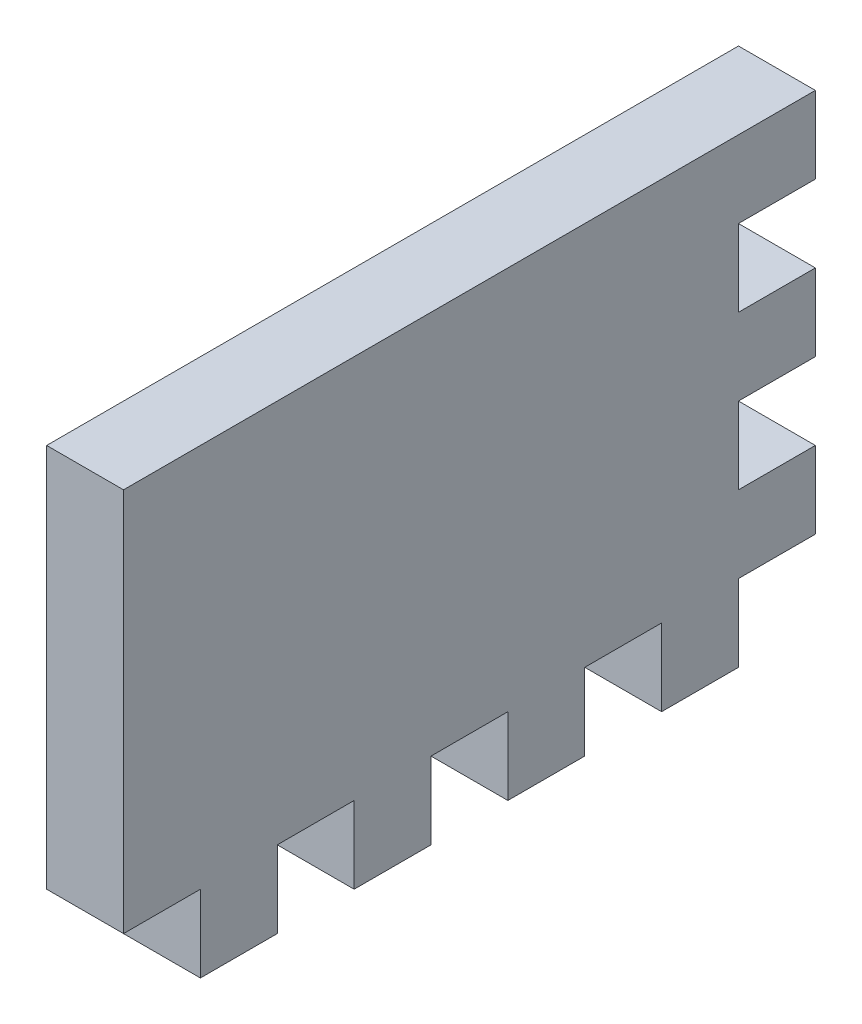
ISO-10303-21;
HEADER;
FILE_DESCRIPTION(('STEP AP214'),'2;1');
FILE_NAME('part.step','',(''),(''),'','','');
FILE_SCHEMA(('AUTOMOTIVE_DESIGN { 1 0 10303 214 1 1 1 1 }'));
ENDSEC;
DATA;
#1=APPLICATION_CONTEXT('core data for automotive mechanical design processes');
#2=APPLICATION_PROTOCOL_DEFINITION('international standard','automotive_design',2000,#1);
#3=PRODUCT_CONTEXT('',#1,'mechanical');
#4=PRODUCT('Part','Part','',(#3));
#5=PRODUCT_RELATED_PRODUCT_CATEGORY('part','',(#4));
#6=PRODUCT_DEFINITION_FORMATION('','',#4);
#7=PRODUCT_DEFINITION_CONTEXT('part definition',#1,'design');
#8=PRODUCT_DEFINITION('design','',#6,#7);
#9=PRODUCT_DEFINITION_SHAPE('','',#8);
#10=(LENGTH_UNIT() NAMED_UNIT(*) SI_UNIT(.MILLI.,.METRE.));
#11=(NAMED_UNIT(*) PLANE_ANGLE_UNIT() SI_UNIT($,.RADIAN.));
#12=(NAMED_UNIT(*) SI_UNIT($,.STERADIAN.) SOLID_ANGLE_UNIT());
#13=UNCERTAINTY_MEASURE_WITH_UNIT(LENGTH_MEASURE(1.E-05),#10,'distance_accuracy_value','');
#14=(GEOMETRIC_REPRESENTATION_CONTEXT(3) GLOBAL_UNCERTAINTY_ASSIGNED_CONTEXT((#13)) GLOBAL_UNIT_ASSIGNED_CONTEXT((#10,
#11,#12)) REPRESENTATION_CONTEXT('',''));
#15=CARTESIAN_POINT('',(0.,0.,0.));
#16=DIRECTION('',(0.,0.,1.));
#17=DIRECTION('',(1.,0.,0.));
#18=AXIS2_PLACEMENT_3D('',#15,#16,#17);
#19=CARTESIAN_POINT('',(12.7,0.,0.));
#20=DIRECTION('',(0.,0.,-1.));
#21=DIRECTION('',(-1.,0.,0.));
#22=AXIS2_PLACEMENT_3D('',#19,#20,#21);
#23=PLANE('',#22);
#24=DIRECTION('',(0.,-1.,0.));
#25=VECTOR('',#24,1.);
#26=CARTESIAN_POINT('',(0.,0.,0.));
#27=LINE('',#26,#25);
#28=CARTESIAN_POINT('',(0.,63.5,0.));
#29=VERTEX_POINT('',#28);
#30=CARTESIAN_POINT('',(0.,0.,0.));
#31=VERTEX_POINT('',#30);
#32=EDGE_CURVE('E250',#29,#31,#27,.T.);
#33=ORIENTED_EDGE('',*,*,#32,.T.);
#34=DIRECTION('',(-1.,0.,0.));
#35=VECTOR('',#34,1.);
#36=CARTESIAN_POINT('',(12.7,0.,0.));
#37=LINE('',#36,#35);
#38=CARTESIAN_POINT('',(12.7,0.,0.));
#39=VERTEX_POINT('',#38);
#40=EDGE_CURVE('E11',#39,#31,#37,.T.);
#41=ORIENTED_EDGE('',*,*,#40,.F.);
#42=DIRECTION('',(0.,-1.,0.));
#43=VECTOR('',#42,1.);
#44=CARTESIAN_POINT('',(12.7,0.,0.));
#45=LINE('',#44,#43);
#46=CARTESIAN_POINT('',(12.7,63.5,0.));
#47=VERTEX_POINT('',#46);
#48=EDGE_CURVE('E305',#47,#39,#45,.T.);
#49=ORIENTED_EDGE('',*,*,#48,.F.);
#50=DIRECTION('',(-1.,0.,0.));
#51=VECTOR('',#50,1.);
#52=CARTESIAN_POINT('',(12.7,63.5,0.));
#53=LINE('',#52,#51);
#54=EDGE_CURVE('E246',#47,#29,#53,.T.);
#55=ORIENTED_EDGE('',*,*,#54,.T.);
#56=EDGE_LOOP('',(#33,#41,#49,#55));
#57=FACE_BOUND('',#56,.T.);
#58=ADVANCED_FACE('F33',(#57),#23,.F.);
#59=CARTESIAN_POINT('',(12.7,0.,0.));
#60=DIRECTION('',(0.,1.,0.));
#61=DIRECTION('',(0.,0.,1.));
#62=AXIS2_PLACEMENT_3D('',#59,#60,#61);
#63=PLANE('',#62);
#64=DIRECTION('',(0.,0.,-1.));
#65=VECTOR('',#64,1.);
#66=CARTESIAN_POINT('',(0.,0.,0.));
#67=LINE('',#66,#65);
#68=CARTESIAN_POINT('',(0.,0.,-12.7));
#69=VERTEX_POINT('',#68);
#70=EDGE_CURVE('E253',#31,#69,#67,.T.);
#71=ORIENTED_EDGE('',*,*,#70,.T.);
#72=DIRECTION('',(-1.,0.,0.));
#73=VECTOR('',#72,1.);
#74=CARTESIAN_POINT('',(12.7,0.,-12.7));
#75=LINE('',#74,#73);
#76=CARTESIAN_POINT('',(12.7,0.,-12.7));
#77=VERTEX_POINT('',#76);
#78=EDGE_CURVE('E41',#77,#69,#75,.T.);
#79=ORIENTED_EDGE('',*,*,#78,.F.);
#80=DIRECTION('',(0.,0.,-1.));
#81=VECTOR('',#80,1.);
#82=CARTESIAN_POINT('',(12.7,0.,0.));
#83=LINE('',#82,#81);
#84=EDGE_CURVE('E150',#39,#77,#83,.T.);
#85=ORIENTED_EDGE('',*,*,#84,.F.);
#86=ORIENTED_EDGE('',*,*,#40,.T.);
#87=EDGE_LOOP('',(#71,#79,#85,#86));
#88=FACE_BOUND('',#87,.T.);
#89=ADVANCED_FACE('F453',(#88),#63,.F.);
#90=CARTESIAN_POINT('',(12.7,0.,-12.7));
#91=DIRECTION('',(0.,0.,-1.));
#92=DIRECTION('',(-1.,0.,0.));
#93=AXIS2_PLACEMENT_3D('',#90,#91,#92);
#94=PLANE('',#93);
#95=DIRECTION('',(0.,-1.,0.));
#96=VECTOR('',#95,1.);
#97=CARTESIAN_POINT('',(0.,0.,-12.7));
#98=LINE('',#97,#96);
#99=CARTESIAN_POINT('',(0.,-12.7,-12.7));
#100=VERTEX_POINT('',#99);
#101=EDGE_CURVE('E255',#69,#100,#98,.T.);
#102=ORIENTED_EDGE('',*,*,#101,.T.);
#103=DIRECTION('',(-1.,0.,0.));
#104=VECTOR('',#103,1.);
#105=CARTESIAN_POINT('',(12.7,-12.7,-12.7));
#106=LINE('',#105,#104);
#107=CARTESIAN_POINT('',(12.7,-12.7,-12.7));
#108=VERTEX_POINT('',#107);
#109=EDGE_CURVE('E372',#108,#100,#106,.T.);
#110=ORIENTED_EDGE('',*,*,#109,.F.);
#111=DIRECTION('',(0.,-1.,0.));
#112=VECTOR('',#111,1.);
#113=CARTESIAN_POINT('',(12.7,0.,-12.7));
#114=LINE('',#113,#112);
#115=EDGE_CURVE('E380',#77,#108,#114,.T.);
#116=ORIENTED_EDGE('',*,*,#115,.F.);
#117=ORIENTED_EDGE('',*,*,#78,.T.);
#118=EDGE_LOOP('',(#102,#110,#116,#117));
#119=FACE_BOUND('',#118,.T.);
#120=ADVANCED_FACE('F378',(#119),#94,.F.);
#121=CARTESIAN_POINT('',(12.7,-12.7,-12.7));
#122=DIRECTION('',(0.,1.,0.));
#123=DIRECTION('',(0.,0.,1.));
#124=AXIS2_PLACEMENT_3D('',#121,#122,#123);
#125=PLANE('',#124);
#126=DIRECTION('',(0.,0.,-1.));
#127=VECTOR('',#126,1.);
#128=CARTESIAN_POINT('',(0.,-12.7,-12.7));
#129=LINE('',#128,#127);
#130=CARTESIAN_POINT('',(0.,-12.7,-25.4));
#131=VERTEX_POINT('',#130);
#132=EDGE_CURVE('E257',#100,#131,#129,.T.);
#133=ORIENTED_EDGE('',*,*,#132,.T.);
#134=DIRECTION('',(-1.,0.,0.));
#135=VECTOR('',#134,1.);
#136=CARTESIAN_POINT('',(12.7,-12.7,-25.4));
#137=LINE('',#136,#135);
#138=CARTESIAN_POINT('',(12.7,-12.7,-25.4));
#139=VERTEX_POINT('',#138);
#140=EDGE_CURVE('E369',#139,#131,#137,.T.);
#141=ORIENTED_EDGE('',*,*,#140,.F.);
#142=DIRECTION('',(0.,0.,-1.));
#143=VECTOR('',#142,1.);
#144=CARTESIAN_POINT('',(12.7,-12.7,-12.7));
#145=LINE('',#144,#143);
#146=EDGE_CURVE('E396',#108,#139,#145,.T.);
#147=ORIENTED_EDGE('',*,*,#146,.F.);
#148=ORIENTED_EDGE('',*,*,#109,.T.);
#149=EDGE_LOOP('',(#133,#141,#147,#148));
#150=FACE_BOUND('',#149,.T.);
#151=ADVANCED_FACE('F387',(#150),#125,.F.);
#152=CARTESIAN_POINT('',(12.7,-12.7,-25.4));
#153=DIRECTION('',(0.,0.,1.));
#154=DIRECTION('',(1.,0.,0.));
#155=AXIS2_PLACEMENT_3D('',#152,#153,#154);
#156=PLANE('',#155);
#157=DIRECTION('',(0.,1.,0.));
#158=VECTOR('',#157,1.);
#159=CARTESIAN_POINT('',(0.,-12.7,-25.4));
#160=LINE('',#159,#158);
#161=CARTESIAN_POINT('',(0.,0.,-25.4));
#162=VERTEX_POINT('',#161);
#163=EDGE_CURVE('E259',#131,#162,#160,.T.);
#164=ORIENTED_EDGE('',*,*,#163,.T.);
#165=DIRECTION('',(-1.,0.,0.));
#166=VECTOR('',#165,1.);
#167=CARTESIAN_POINT('',(12.7,0.,-25.4));
#168=LINE('',#167,#166);
#169=CARTESIAN_POINT('',(12.7,0.,-25.4));
#170=VERTEX_POINT('',#169);
#171=EDGE_CURVE('E366',#170,#162,#168,.T.);
#172=ORIENTED_EDGE('',*,*,#171,.F.);
#173=DIRECTION('',(0.,1.,0.));
#174=VECTOR('',#173,1.);
#175=CARTESIAN_POINT('',(12.7,-12.7,-25.4));
#176=LINE('',#175,#174);
#177=EDGE_CURVE('E393',#139,#170,#176,.T.);
#178=ORIENTED_EDGE('',*,*,#177,.F.);
#179=ORIENTED_EDGE('',*,*,#140,.T.);
#180=EDGE_LOOP('',(#164,#172,#178,#179));
#181=FACE_BOUND('',#180,.T.);
#182=ADVANCED_FACE('F391',(#181),#156,.F.);
#183=CARTESIAN_POINT('',(12.7,0.,-25.4));
#184=DIRECTION('',(0.,1.,0.));
#185=DIRECTION('',(0.,0.,1.));
#186=AXIS2_PLACEMENT_3D('',#183,#184,#185);
#187=PLANE('',#186);
#188=DIRECTION('',(0.,0.,-1.));
#189=VECTOR('',#188,1.);
#190=CARTESIAN_POINT('',(0.,0.,-25.4));
#191=LINE('',#190,#189);
#192=CARTESIAN_POINT('',(0.,0.,-38.1));
#193=VERTEX_POINT('',#192);
#194=EDGE_CURVE('E261',#162,#193,#191,.T.);
#195=ORIENTED_EDGE('',*,*,#194,.T.);
#196=DIRECTION('',(-1.,0.,0.));
#197=VECTOR('',#196,1.);
#198=CARTESIAN_POINT('',(12.7,0.,-38.1));
#199=LINE('',#198,#197);
#200=CARTESIAN_POINT('',(12.7,0.,-38.1));
#201=VERTEX_POINT('',#200);
#202=EDGE_CURVE('E363',#201,#193,#199,.T.);
#203=ORIENTED_EDGE('',*,*,#202,.F.);
#204=DIRECTION('',(0.,0.,-1.));
#205=VECTOR('',#204,1.);
#206=CARTESIAN_POINT('',(12.7,0.,-25.4));
#207=LINE('',#206,#205);
#208=EDGE_CURVE('E395',#170,#201,#207,.T.);
#209=ORIENTED_EDGE('',*,*,#208,.F.);
#210=ORIENTED_EDGE('',*,*,#171,.T.);
#211=EDGE_LOOP('',(#195,#203,#209,#210));
#212=FACE_BOUND('',#211,.T.);
#213=ADVANCED_FACE('F465',(#212),#187,.F.);
#214=CARTESIAN_POINT('',(12.7,0.,-38.1));
#215=DIRECTION('',(0.,0.,-1.));
#216=DIRECTION('',(-1.,0.,0.));
#217=AXIS2_PLACEMENT_3D('',#214,#215,#216);
#218=PLANE('',#217);
#219=DIRECTION('',(0.,-1.,0.));
#220=VECTOR('',#219,1.);
#221=CARTESIAN_POINT('',(0.,0.,-38.1));
#222=LINE('',#221,#220);
#223=CARTESIAN_POINT('',(0.,-12.7,-38.1));
#224=VERTEX_POINT('',#223);
#225=EDGE_CURVE('E263',#193,#224,#222,.T.);
#226=ORIENTED_EDGE('',*,*,#225,.T.);
#227=DIRECTION('',(-1.,0.,0.));
#228=VECTOR('',#227,1.);
#229=CARTESIAN_POINT('',(12.7,-12.7,-38.1));
#230=LINE('',#229,#228);
#231=CARTESIAN_POINT('',(12.7,-12.7,-38.1));
#232=VERTEX_POINT('',#231);
#233=EDGE_CURVE('E360',#232,#224,#230,.T.);
#234=ORIENTED_EDGE('',*,*,#233,.F.);
#235=DIRECTION('',(0.,-1.,0.));
#236=VECTOR('',#235,1.);
#237=CARTESIAN_POINT('',(12.7,0.,-38.1));
#238=LINE('',#237,#236);
#239=EDGE_CURVE('E398',#201,#232,#238,.T.);
#240=ORIENTED_EDGE('',*,*,#239,.F.);
#241=ORIENTED_EDGE('',*,*,#202,.T.);
#242=EDGE_LOOP('',(#226,#234,#240,#241));
#243=FACE_BOUND('',#242,.T.);
#244=ADVANCED_FACE('F468',(#243),#218,.F.);
#245=CARTESIAN_POINT('',(12.7,-12.7,-38.1));
#246=DIRECTION('',(0.,1.,0.));
#247=DIRECTION('',(0.,0.,1.));
#248=AXIS2_PLACEMENT_3D('',#245,#246,#247);
#249=PLANE('',#248);
#250=DIRECTION('',(0.,0.,-1.));
#251=VECTOR('',#250,1.);
#252=CARTESIAN_POINT('',(0.,-12.7,-38.1));
#253=LINE('',#252,#251);
#254=CARTESIAN_POINT('',(0.,-12.7,-50.8));
#255=VERTEX_POINT('',#254);
#256=EDGE_CURVE('E265',#224,#255,#253,.T.);
#257=ORIENTED_EDGE('',*,*,#256,.T.);
#258=DIRECTION('',(-1.,0.,0.));
#259=VECTOR('',#258,1.);
#260=CARTESIAN_POINT('',(12.7,-12.7,-50.8));
#261=LINE('',#260,#259);
#262=CARTESIAN_POINT('',(12.7,-12.7,-50.8));
#263=VERTEX_POINT('',#262);
#264=EDGE_CURVE('E357',#263,#255,#261,.T.);
#265=ORIENTED_EDGE('',*,*,#264,.F.);
#266=DIRECTION('',(0.,0.,-1.));
#267=VECTOR('',#266,1.);
#268=CARTESIAN_POINT('',(12.7,-12.7,-38.1));
#269=LINE('',#268,#267);
#270=EDGE_CURVE('E404',#232,#263,#269,.T.);
#271=ORIENTED_EDGE('',*,*,#270,.F.);
#272=ORIENTED_EDGE('',*,*,#233,.T.);
#273=EDGE_LOOP('',(#257,#265,#271,#272));
#274=FACE_BOUND('',#273,.T.);
#275=ADVANCED_FACE('F472',(#274),#249,.F.);
#276=CARTESIAN_POINT('',(12.7,-12.7,-50.8));
#277=DIRECTION('',(0.,0.,1.));
#278=DIRECTION('',(1.,0.,0.));
#279=AXIS2_PLACEMENT_3D('',#276,#277,#278);
#280=PLANE('',#279);
#281=DIRECTION('',(0.,1.,0.));
#282=VECTOR('',#281,1.);
#283=CARTESIAN_POINT('',(0.,-12.7,-50.8));
#284=LINE('',#283,#282);
#285=CARTESIAN_POINT('',(0.,0.,-50.8));
#286=VERTEX_POINT('',#285);
#287=EDGE_CURVE('E267',#255,#286,#284,.T.);
#288=ORIENTED_EDGE('',*,*,#287,.T.);
#289=DIRECTION('',(-1.,0.,0.));
#290=VECTOR('',#289,1.);
#291=CARTESIAN_POINT('',(12.7,0.,-50.8));
#292=LINE('',#291,#290);
#293=CARTESIAN_POINT('',(12.7,0.,-50.8));
#294=VERTEX_POINT('',#293);
#295=EDGE_CURVE('E354',#294,#286,#292,.T.);
#296=ORIENTED_EDGE('',*,*,#295,.F.);
#297=DIRECTION('',(0.,1.,0.));
#298=VECTOR('',#297,1.);
#299=CARTESIAN_POINT('',(12.7,-12.7,-50.8));
#300=LINE('',#299,#298);
#301=EDGE_CURVE('E406',#263,#294,#300,.T.);
#302=ORIENTED_EDGE('',*,*,#301,.F.);
#303=ORIENTED_EDGE('',*,*,#264,.T.);
#304=EDGE_LOOP('',(#288,#296,#302,#303));
#305=FACE_BOUND('',#304,.T.);
#306=ADVANCED_FACE('F476',(#305),#280,.F.);
#307=CARTESIAN_POINT('',(12.7,0.,-50.8));
#308=DIRECTION('',(0.,1.,0.));
#309=DIRECTION('',(0.,0.,1.));
#310=AXIS2_PLACEMENT_3D('',#307,#308,#309);
#311=PLANE('',#310);
#312=DIRECTION('',(0.,0.,-1.));
#313=VECTOR('',#312,1.);
#314=CARTESIAN_POINT('',(0.,0.,-50.8));
#315=LINE('',#314,#313);
#316=CARTESIAN_POINT('',(0.,0.,-63.5));
#317=VERTEX_POINT('',#316);
#318=EDGE_CURVE('E269',#286,#317,#315,.T.);
#319=ORIENTED_EDGE('',*,*,#318,.T.);
#320=DIRECTION('',(-1.,0.,0.));
#321=VECTOR('',#320,1.);
#322=CARTESIAN_POINT('',(12.7,0.,-63.5));
#323=LINE('',#322,#321);
#324=CARTESIAN_POINT('',(12.7,0.,-63.5));
#325=VERTEX_POINT('',#324);
#326=EDGE_CURVE('E351',#325,#317,#323,.T.);
#327=ORIENTED_EDGE('',*,*,#326,.F.);
#328=DIRECTION('',(0.,0.,-1.));
#329=VECTOR('',#328,1.);
#330=CARTESIAN_POINT('',(12.7,0.,-50.8));
#331=LINE('',#330,#329);
#332=EDGE_CURVE('E408',#294,#325,#331,.T.);
#333=ORIENTED_EDGE('',*,*,#332,.F.);
#334=ORIENTED_EDGE('',*,*,#295,.T.);
#335=EDGE_LOOP('',(#319,#327,#333,#334));
#336=FACE_BOUND('',#335,.T.);
#337=ADVANCED_FACE('F480',(#336),#311,.F.);
#338=CARTESIAN_POINT('',(12.7,0.,-63.5));
#339=DIRECTION('',(0.,0.,-1.));
#340=DIRECTION('',(-1.,0.,0.));
#341=AXIS2_PLACEMENT_3D('',#338,#339,#340);
#342=PLANE('',#341);
#343=DIRECTION('',(0.,-1.,0.));
#344=VECTOR('',#343,1.);
#345=CARTESIAN_POINT('',(0.,0.,-63.5));
#346=LINE('',#345,#344);
#347=CARTESIAN_POINT('',(0.,-12.7,-63.5));
#348=VERTEX_POINT('',#347);
#349=EDGE_CURVE('E271',#317,#348,#346,.T.);
#350=ORIENTED_EDGE('',*,*,#349,.T.);
#351=DIRECTION('',(-1.,0.,0.));
#352=VECTOR('',#351,1.);
#353=CARTESIAN_POINT('',(12.7,-12.7,-63.5));
#354=LINE('',#353,#352);
#355=CARTESIAN_POINT('',(12.7,-12.7,-63.5));
#356=VERTEX_POINT('',#355);
#357=EDGE_CURVE('E348',#356,#348,#354,.T.);
#358=ORIENTED_EDGE('',*,*,#357,.F.);
#359=DIRECTION('',(0.,-1.,0.));
#360=VECTOR('',#359,1.);
#361=CARTESIAN_POINT('',(12.7,0.,-63.5));
#362=LINE('',#361,#360);
#363=EDGE_CURVE('E410',#325,#356,#362,.T.);
#364=ORIENTED_EDGE('',*,*,#363,.F.);
#365=ORIENTED_EDGE('',*,*,#326,.T.);
#366=EDGE_LOOP('',(#350,#358,#364,#365));
#367=FACE_BOUND('',#366,.T.);
#368=ADVANCED_FACE('F484',(#367),#342,.F.);
#369=CARTESIAN_POINT('',(12.7,-12.7,-63.5));
#370=DIRECTION('',(0.,1.,0.));
#371=DIRECTION('',(0.,0.,1.));
#372=AXIS2_PLACEMENT_3D('',#369,#370,#371);
#373=PLANE('',#372);
#374=DIRECTION('',(0.,0.,-1.));
#375=VECTOR('',#374,1.);
#376=CARTESIAN_POINT('',(0.,-12.7,-63.5));
#377=LINE('',#376,#375);
#378=CARTESIAN_POINT('',(0.,-12.7,-76.2));
#379=VERTEX_POINT('',#378);
#380=EDGE_CURVE('E273',#348,#379,#377,.T.);
#381=ORIENTED_EDGE('',*,*,#380,.T.);
#382=DIRECTION('',(-1.,0.,0.));
#383=VECTOR('',#382,1.);
#384=CARTESIAN_POINT('',(12.7,-12.7,-76.2));
#385=LINE('',#384,#383);
#386=CARTESIAN_POINT('',(12.7,-12.7,-76.2));
#387=VERTEX_POINT('',#386);
#388=EDGE_CURVE('E345',#387,#379,#385,.T.);
#389=ORIENTED_EDGE('',*,*,#388,.F.);
#390=DIRECTION('',(0.,0.,-1.));
#391=VECTOR('',#390,1.);
#392=CARTESIAN_POINT('',(12.7,-12.7,-63.5));
#393=LINE('',#392,#391);
#394=EDGE_CURVE('E412',#356,#387,#393,.T.);
#395=ORIENTED_EDGE('',*,*,#394,.F.);
#396=ORIENTED_EDGE('',*,*,#357,.T.);
#397=EDGE_LOOP('',(#381,#389,#395,#396));
#398=FACE_BOUND('',#397,.T.);
#399=ADVANCED_FACE('F488',(#398),#373,.F.);
#400=CARTESIAN_POINT('',(12.7,-12.7,-76.2));
#401=DIRECTION('',(0.,0.,1.));
#402=DIRECTION('',(1.,0.,0.));
#403=AXIS2_PLACEMENT_3D('',#400,#401,#402);
#404=PLANE('',#403);
#405=DIRECTION('',(0.,1.,0.));
#406=VECTOR('',#405,1.);
#407=CARTESIAN_POINT('',(0.,-12.7,-76.2));
#408=LINE('',#407,#406);
#409=CARTESIAN_POINT('',(0.,0.,-76.2));
#410=VERTEX_POINT('',#409);
#411=EDGE_CURVE('E275',#379,#410,#408,.T.);
#412=ORIENTED_EDGE('',*,*,#411,.T.);
#413=DIRECTION('',(-1.,0.,0.));
#414=VECTOR('',#413,1.);
#415=CARTESIAN_POINT('',(12.7,0.,-76.2));
#416=LINE('',#415,#414);
#417=CARTESIAN_POINT('',(12.7,0.,-76.2));
#418=VERTEX_POINT('',#417);
#419=EDGE_CURVE('E342',#418,#410,#416,.T.);
#420=ORIENTED_EDGE('',*,*,#419,.F.);
#421=DIRECTION('',(0.,1.,0.));
#422=VECTOR('',#421,1.);
#423=CARTESIAN_POINT('',(12.7,-12.7,-76.2));
#424=LINE('',#423,#422);
#425=EDGE_CURVE('E414',#387,#418,#424,.T.);
#426=ORIENTED_EDGE('',*,*,#425,.F.);
#427=ORIENTED_EDGE('',*,*,#388,.T.);
#428=EDGE_LOOP('',(#412,#420,#426,#427));
#429=FACE_BOUND('',#428,.T.);
#430=ADVANCED_FACE('F492',(#429),#404,.F.);
#431=CARTESIAN_POINT('',(12.7,0.,-76.2));
#432=DIRECTION('',(0.,1.,0.));
#433=DIRECTION('',(0.,0.,1.));
#434=AXIS2_PLACEMENT_3D('',#431,#432,#433);
#435=PLANE('',#434);
#436=DIRECTION('',(0.,0.,-1.));
#437=VECTOR('',#436,1.);
#438=CARTESIAN_POINT('',(0.,0.,-76.2));
#439=LINE('',#438,#437);
#440=CARTESIAN_POINT('',(0.,0.,-88.9));
#441=VERTEX_POINT('',#440);
#442=EDGE_CURVE('E277',#410,#441,#439,.T.);
#443=ORIENTED_EDGE('',*,*,#442,.T.);
#444=DIRECTION('',(-1.,0.,0.));
#445=VECTOR('',#444,1.);
#446=CARTESIAN_POINT('',(12.7,0.,-88.9));
#447=LINE('',#446,#445);
#448=CARTESIAN_POINT('',(12.7,0.,-88.9));
#449=VERTEX_POINT('',#448);
#450=EDGE_CURVE('E339',#449,#441,#447,.T.);
#451=ORIENTED_EDGE('',*,*,#450,.F.);
#452=DIRECTION('',(0.,0.,-1.));
#453=VECTOR('',#452,1.);
#454=CARTESIAN_POINT('',(12.7,0.,-76.2));
#455=LINE('',#454,#453);
#456=EDGE_CURVE('E416',#418,#449,#455,.T.);
#457=ORIENTED_EDGE('',*,*,#456,.F.);
#458=ORIENTED_EDGE('',*,*,#419,.T.);
#459=EDGE_LOOP('',(#443,#451,#457,#458));
#460=FACE_BOUND('',#459,.T.);
#461=ADVANCED_FACE('F496',(#460),#435,.F.);
#462=CARTESIAN_POINT('',(12.7,0.,-88.9));
#463=DIRECTION('',(0.,0.,-1.));
#464=DIRECTION('',(-1.,0.,0.));
#465=AXIS2_PLACEMENT_3D('',#462,#463,#464);
#466=PLANE('',#465);
#467=DIRECTION('',(0.,-1.,0.));
#468=VECTOR('',#467,1.);
#469=CARTESIAN_POINT('',(0.,0.,-88.9));
#470=LINE('',#469,#468);
#471=CARTESIAN_POINT('',(0.,-12.7,-88.9));
#472=VERTEX_POINT('',#471);
#473=EDGE_CURVE('E279',#441,#472,#470,.T.);
#474=ORIENTED_EDGE('',*,*,#473,.T.);
#475=DIRECTION('',(-1.,0.,0.));
#476=VECTOR('',#475,1.);
#477=CARTESIAN_POINT('',(12.7,-12.7,-88.9));
#478=LINE('',#477,#476);
#479=CARTESIAN_POINT('',(12.7,-12.7,-88.9));
#480=VERTEX_POINT('',#479);
#481=EDGE_CURVE('E336',#480,#472,#478,.T.);
#482=ORIENTED_EDGE('',*,*,#481,.F.);
#483=DIRECTION('',(0.,-1.,0.));
#484=VECTOR('',#483,1.);
#485=CARTESIAN_POINT('',(12.7,0.,-88.9));
#486=LINE('',#485,#484);
#487=EDGE_CURVE('E418',#449,#480,#486,.T.);
#488=ORIENTED_EDGE('',*,*,#487,.F.);
#489=ORIENTED_EDGE('',*,*,#450,.T.);
#490=EDGE_LOOP('',(#474,#482,#488,#489));
#491=FACE_BOUND('',#490,.T.);
#492=ADVANCED_FACE('F500',(#491),#466,.F.);
#493=CARTESIAN_POINT('',(12.7,-12.7,-88.9));
#494=DIRECTION('',(0.,1.,0.));
#495=DIRECTION('',(0.,0.,1.));
#496=AXIS2_PLACEMENT_3D('',#493,#494,#495);
#497=PLANE('',#496);
#498=DIRECTION('',(0.,0.,-1.));
#499=VECTOR('',#498,1.);
#500=CARTESIAN_POINT('',(0.,-12.7,-88.9));
#501=LINE('',#500,#499);
#502=CARTESIAN_POINT('',(0.,-12.7,-101.6));
#503=VERTEX_POINT('',#502);
#504=EDGE_CURVE('E281',#472,#503,#501,.T.);
#505=ORIENTED_EDGE('',*,*,#504,.T.);
#506=DIRECTION('',(-1.,0.,0.));
#507=VECTOR('',#506,1.);
#508=CARTESIAN_POINT('',(12.7,-12.7,-101.6));
#509=LINE('',#508,#507);
#510=CARTESIAN_POINT('',(12.7,-12.7,-101.6));
#511=VERTEX_POINT('',#510);
#512=EDGE_CURVE('E333',#511,#503,#509,.T.);
#513=ORIENTED_EDGE('',*,*,#512,.F.);
#514=DIRECTION('',(0.,0.,-1.));
#515=VECTOR('',#514,1.);
#516=CARTESIAN_POINT('',(12.7,-12.7,-88.9));
#517=LINE('',#516,#515);
#518=EDGE_CURVE('E420',#480,#511,#517,.T.);
#519=ORIENTED_EDGE('',*,*,#518,.F.);
#520=ORIENTED_EDGE('',*,*,#481,.T.);
#521=EDGE_LOOP('',(#505,#513,#519,#520));
#522=FACE_BOUND('',#521,.T.);
#523=ADVANCED_FACE('F504',(#522),#497,.F.);
#524=CARTESIAN_POINT('',(12.7,-12.7,-101.6));
#525=DIRECTION('',(0.,0.,1.));
#526=DIRECTION('',(1.,0.,0.));
#527=AXIS2_PLACEMENT_3D('',#524,#525,#526);
#528=PLANE('',#527);
#529=DIRECTION('',(0.,1.,0.));
#530=VECTOR('',#529,1.);
#531=CARTESIAN_POINT('',(0.,-12.7,-101.6));
#532=LINE('',#531,#530);
#533=CARTESIAN_POINT('',(0.,0.,-101.6));
#534=VERTEX_POINT('',#533);
#535=EDGE_CURVE('E283',#503,#534,#532,.T.);
#536=ORIENTED_EDGE('',*,*,#535,.T.);
#537=DIRECTION('',(-1.,0.,0.));
#538=VECTOR('',#537,1.);
#539=CARTESIAN_POINT('',(12.7,0.,-101.6));
#540=LINE('',#539,#538);
#541=CARTESIAN_POINT('',(12.7,0.,-101.6));
#542=VERTEX_POINT('',#541);
#543=EDGE_CURVE('E330',#542,#534,#540,.T.);
#544=ORIENTED_EDGE('',*,*,#543,.F.);
#545=DIRECTION('',(0.,1.,0.));
#546=VECTOR('',#545,1.);
#547=CARTESIAN_POINT('',(12.7,-12.7,-101.6));
#548=LINE('',#547,#546);
#549=EDGE_CURVE('E422',#511,#542,#548,.T.);
#550=ORIENTED_EDGE('',*,*,#549,.F.);
#551=ORIENTED_EDGE('',*,*,#512,.T.);
#552=EDGE_LOOP('',(#536,#544,#550,#551));
#553=FACE_BOUND('',#552,.T.);
#554=ADVANCED_FACE('F508',(#553),#528,.F.);
#555=CARTESIAN_POINT('',(12.7,0.,-101.6));
#556=DIRECTION('',(0.,1.,0.));
#557=DIRECTION('',(0.,0.,1.));
#558=AXIS2_PLACEMENT_3D('',#555,#556,#557);
#559=PLANE('',#558);
#560=DIRECTION('',(0.,0.,-1.));
#561=VECTOR('',#560,1.);
#562=CARTESIAN_POINT('',(0.,0.,-101.6));
#563=LINE('',#562,#561);
#564=CARTESIAN_POINT('',(0.,0.,-114.3));
#565=VERTEX_POINT('',#564);
#566=EDGE_CURVE('E285',#534,#565,#563,.T.);
#567=ORIENTED_EDGE('',*,*,#566,.T.);
#568=DIRECTION('',(-1.,0.,0.));
#569=VECTOR('',#568,1.);
#570=CARTESIAN_POINT('',(12.7,0.,-114.3));
#571=LINE('',#570,#569);
#572=CARTESIAN_POINT('',(12.7,0.,-114.3));
#573=VERTEX_POINT('',#572);
#574=EDGE_CURVE('E327',#573,#565,#571,.T.);
#575=ORIENTED_EDGE('',*,*,#574,.F.);
#576=DIRECTION('',(0.,0.,-1.));
#577=VECTOR('',#576,1.);
#578=CARTESIAN_POINT('',(12.7,0.,-101.6));
#579=LINE('',#578,#577);
#580=EDGE_CURVE('E424',#542,#573,#579,.T.);
#581=ORIENTED_EDGE('',*,*,#580,.F.);
#582=ORIENTED_EDGE('',*,*,#543,.T.);
#583=EDGE_LOOP('',(#567,#575,#581,#582));
#584=FACE_BOUND('',#583,.T.);
#585=ADVANCED_FACE('F512',(#584),#559,.F.);
#586=CARTESIAN_POINT('',(12.7,0.,-114.3));
#587=DIRECTION('',(0.,0.,1.));
#588=DIRECTION('',(1.,0.,0.));
#589=AXIS2_PLACEMENT_3D('',#586,#587,#588);
#590=PLANE('',#589);
#591=DIRECTION('',(0.,1.,0.));
#592=VECTOR('',#591,1.);
#593=CARTESIAN_POINT('',(0.,0.,-114.3));
#594=LINE('',#593,#592);
#595=CARTESIAN_POINT('',(0.,12.7,-114.3));
#596=VERTEX_POINT('',#595);
#597=EDGE_CURVE('E287',#565,#596,#594,.T.);
#598=ORIENTED_EDGE('',*,*,#597,.T.);
#599=DIRECTION('',(-1.,0.,0.));
#600=VECTOR('',#599,1.);
#601=CARTESIAN_POINT('',(12.7,12.7,-114.3));
#602=LINE('',#601,#600);
#603=CARTESIAN_POINT('',(12.7,12.7,-114.3));
#604=VERTEX_POINT('',#603);
#605=EDGE_CURVE('E324',#604,#596,#602,.T.);
#606=ORIENTED_EDGE('',*,*,#605,.F.);
#607=DIRECTION('',(0.,1.,0.));
#608=VECTOR('',#607,1.);
#609=CARTESIAN_POINT('',(12.7,0.,-114.3));
#610=LINE('',#609,#608);
#611=EDGE_CURVE('E426',#573,#604,#610,.T.);
#612=ORIENTED_EDGE('',*,*,#611,.F.);
#613=ORIENTED_EDGE('',*,*,#574,.T.);
#614=EDGE_LOOP('',(#598,#606,#612,#613));
#615=FACE_BOUND('',#614,.T.);
#616=ADVANCED_FACE('F516',(#615),#590,.F.);
#617=CARTESIAN_POINT('',(12.7,12.7,-114.3));
#618=DIRECTION('',(0.,-1.,0.));
#619=DIRECTION('',(0.,0.,-1.));
#620=AXIS2_PLACEMENT_3D('',#617,#618,#619);
#621=PLANE('',#620);
#622=DIRECTION('',(0.,0.,1.));
#623=VECTOR('',#622,1.);
#624=CARTESIAN_POINT('',(0.,12.7,-114.3));
#625=LINE('',#624,#623);
#626=CARTESIAN_POINT('',(0.,12.7,-101.6));
#627=VERTEX_POINT('',#626);
#628=EDGE_CURVE('E289',#596,#627,#625,.T.);
#629=ORIENTED_EDGE('',*,*,#628,.T.);
#630=DIRECTION('',(-1.,0.,0.));
#631=VECTOR('',#630,1.);
#632=CARTESIAN_POINT('',(12.7,12.7,-101.6));
#633=LINE('',#632,#631);
#634=CARTESIAN_POINT('',(12.7,12.7,-101.6));
#635=VERTEX_POINT('',#634);
#636=EDGE_CURVE('E321',#635,#627,#633,.T.);
#637=ORIENTED_EDGE('',*,*,#636,.F.);
#638=DIRECTION('',(0.,0.,1.));
#639=VECTOR('',#638,1.);
#640=CARTESIAN_POINT('',(12.7,12.7,-114.3));
#641=LINE('',#640,#639);
#642=EDGE_CURVE('E428',#604,#635,#641,.T.);
#643=ORIENTED_EDGE('',*,*,#642,.F.);
#644=ORIENTED_EDGE('',*,*,#605,.T.);
#645=EDGE_LOOP('',(#629,#637,#643,#644));
#646=FACE_BOUND('',#645,.T.);
#647=ADVANCED_FACE('F520',(#646),#621,.F.);
#648=CARTESIAN_POINT('',(12.7,12.7,-101.6));
#649=DIRECTION('',(0.,0.,1.));
#650=DIRECTION('',(0.,-1.,0.));
#651=AXIS2_PLACEMENT_3D('',#648,#649,#650);
#652=PLANE('',#651);
#653=DIRECTION('',(0.,1.,0.));
#654=VECTOR('',#653,1.);
#655=CARTESIAN_POINT('',(0.,12.7,-101.6));
#656=LINE('',#655,#654);
#657=CARTESIAN_POINT('',(0.,25.4,-101.6));
#658=VERTEX_POINT('',#657);
#659=EDGE_CURVE('E291',#627,#658,#656,.T.);
#660=ORIENTED_EDGE('',*,*,#659,.T.);
#661=DIRECTION('',(-1.,0.,0.));
#662=VECTOR('',#661,1.);
#663=CARTESIAN_POINT('',(12.7,25.4,-101.6));
#664=LINE('',#663,#662);
#665=CARTESIAN_POINT('',(12.7,25.4,-101.6));
#666=VERTEX_POINT('',#665);
#667=EDGE_CURVE('E318',#666,#658,#664,.T.);
#668=ORIENTED_EDGE('',*,*,#667,.F.);
#669=DIRECTION('',(0.,1.,0.));
#670=VECTOR('',#669,1.);
#671=CARTESIAN_POINT('',(12.7,12.7,-101.6));
#672=LINE('',#671,#670);
#673=EDGE_CURVE('E430',#635,#666,#672,.T.);
#674=ORIENTED_EDGE('',*,*,#673,.F.);
#675=ORIENTED_EDGE('',*,*,#636,.T.);
#676=EDGE_LOOP('',(#660,#668,#674,#675));
#677=FACE_BOUND('',#676,.T.);
#678=ADVANCED_FACE('F524',(#677),#652,.F.);
#679=CARTESIAN_POINT('',(12.7,25.4,-101.6));
#680=DIRECTION('',(0.,1.,0.));
#681=DIRECTION('',(0.,0.,1.));
#682=AXIS2_PLACEMENT_3D('',#679,#680,#681);
#683=PLANE('',#682);
#684=DIRECTION('',(0.,0.,-1.));
#685=VECTOR('',#684,1.);
#686=CARTESIAN_POINT('',(0.,25.4,-101.6));
#687=LINE('',#686,#685);
#688=CARTESIAN_POINT('',(0.,25.4,-114.3));
#689=VERTEX_POINT('',#688);
#690=EDGE_CURVE('E293',#658,#689,#687,.T.);
#691=ORIENTED_EDGE('',*,*,#690,.T.);
#692=DIRECTION('',(-1.,0.,0.));
#693=VECTOR('',#692,1.);
#694=CARTESIAN_POINT('',(12.7,25.4,-114.3));
#695=LINE('',#694,#693);
#696=CARTESIAN_POINT('',(12.7,25.4,-114.3));
#697=VERTEX_POINT('',#696);
#698=EDGE_CURVE('E315',#697,#689,#695,.T.);
#699=ORIENTED_EDGE('',*,*,#698,.F.);
#700=DIRECTION('',(0.,0.,-1.));
#701=VECTOR('',#700,1.);
#702=CARTESIAN_POINT('',(12.7,25.4,-101.6));
#703=LINE('',#702,#701);
#704=EDGE_CURVE('E432',#666,#697,#703,.T.);
#705=ORIENTED_EDGE('',*,*,#704,.F.);
#706=ORIENTED_EDGE('',*,*,#667,.T.);
#707=EDGE_LOOP('',(#691,#699,#705,#706));
#708=FACE_BOUND('',#707,.T.);
#709=ADVANCED_FACE('F528',(#708),#683,.F.);
#710=CARTESIAN_POINT('',(12.7,25.4,-114.3));
#711=DIRECTION('',(0.,0.,1.));
#712=DIRECTION('',(1.,0.,0.));
#713=AXIS2_PLACEMENT_3D('',#710,#711,#712);
#714=PLANE('',#713);
#715=DIRECTION('',(0.,1.,0.));
#716=VECTOR('',#715,1.);
#717=CARTESIAN_POINT('',(0.,25.4,-114.3));
#718=LINE('',#717,#716);
#719=CARTESIAN_POINT('',(0.,38.1,-114.3));
#720=VERTEX_POINT('',#719);
#721=EDGE_CURVE('E295',#689,#720,#718,.T.);
#722=ORIENTED_EDGE('',*,*,#721,.T.);
#723=DIRECTION('',(-1.,0.,0.));
#724=VECTOR('',#723,1.);
#725=CARTESIAN_POINT('',(12.7,38.1,-114.3));
#726=LINE('',#725,#724);
#727=CARTESIAN_POINT('',(12.7,38.1,-114.3));
#728=VERTEX_POINT('',#727);
#729=EDGE_CURVE('E312',#728,#720,#726,.T.);
#730=ORIENTED_EDGE('',*,*,#729,.F.);
#731=DIRECTION('',(0.,1.,0.));
#732=VECTOR('',#731,1.);
#733=CARTESIAN_POINT('',(12.7,25.4,-114.3));
#734=LINE('',#733,#732);
#735=EDGE_CURVE('E434',#697,#728,#734,.T.);
#736=ORIENTED_EDGE('',*,*,#735,.F.);
#737=ORIENTED_EDGE('',*,*,#698,.T.);
#738=EDGE_LOOP('',(#722,#730,#736,#737));
#739=FACE_BOUND('',#738,.T.);
#740=ADVANCED_FACE('F532',(#739),#714,.F.);
#741=CARTESIAN_POINT('',(12.7,38.1,-114.3));
#742=DIRECTION('',(0.,-1.,0.));
#743=DIRECTION('',(0.,0.,-1.));
#744=AXIS2_PLACEMENT_3D('',#741,#742,#743);
#745=PLANE('',#744);
#746=DIRECTION('',(0.,0.,1.));
#747=VECTOR('',#746,1.);
#748=CARTESIAN_POINT('',(0.,38.1,-114.3));
#749=LINE('',#748,#747);
#750=CARTESIAN_POINT('',(0.,38.1,-101.6));
#751=VERTEX_POINT('',#750);
#752=EDGE_CURVE('E297',#720,#751,#749,.T.);
#753=ORIENTED_EDGE('',*,*,#752,.T.);
#754=DIRECTION('',(-1.,0.,0.));
#755=VECTOR('',#754,1.);
#756=CARTESIAN_POINT('',(12.7,38.1,-101.6));
#757=LINE('',#756,#755);
#758=CARTESIAN_POINT('',(12.7,38.1,-101.6));
#759=VERTEX_POINT('',#758);
#760=EDGE_CURVE('E309',#759,#751,#757,.T.);
#761=ORIENTED_EDGE('',*,*,#760,.F.);
#762=DIRECTION('',(0.,0.,1.));
#763=VECTOR('',#762,1.);
#764=CARTESIAN_POINT('',(12.7,38.1,-114.3));
#765=LINE('',#764,#763);
#766=EDGE_CURVE('E436',#728,#759,#765,.T.);
#767=ORIENTED_EDGE('',*,*,#766,.F.);
#768=ORIENTED_EDGE('',*,*,#729,.T.);
#769=EDGE_LOOP('',(#753,#761,#767,#768));
#770=FACE_BOUND('',#769,.T.);
#771=ADVANCED_FACE('F442',(#770),#745,.F.);
#772=CARTESIAN_POINT('',(12.7,38.1,-101.6));
#773=DIRECTION('',(0.,0.,1.));
#774=DIRECTION('',(0.,-1.,0.));
#775=AXIS2_PLACEMENT_3D('',#772,#773,#774);
#776=PLANE('',#775);
#777=DIRECTION('',(0.,1.,0.));
#778=VECTOR('',#777,1.);
#779=CARTESIAN_POINT('',(0.,38.1,-101.6));
#780=LINE('',#779,#778);
#781=CARTESIAN_POINT('',(0.,50.8,-101.6));
#782=VERTEX_POINT('',#781);
#783=EDGE_CURVE('E299',#751,#782,#780,.T.);
#784=ORIENTED_EDGE('',*,*,#783,.T.);
#785=DIRECTION('',(-1.,0.,0.));
#786=VECTOR('',#785,1.);
#787=CARTESIAN_POINT('',(12.7,50.8,-101.6));
#788=LINE('',#787,#786);
#789=CARTESIAN_POINT('',(12.7,50.8,-101.6));
#790=VERTEX_POINT('',#789);
#791=EDGE_CURVE('E241',#790,#782,#788,.T.);
#792=ORIENTED_EDGE('',*,*,#791,.F.);
#793=DIRECTION('',(0.,1.,0.));
#794=VECTOR('',#793,1.);
#795=CARTESIAN_POINT('',(12.7,38.1,-101.6));
#796=LINE('',#795,#794);
#797=EDGE_CURVE('E230',#759,#790,#796,.T.);
#798=ORIENTED_EDGE('',*,*,#797,.F.);
#799=ORIENTED_EDGE('',*,*,#760,.T.);
#800=EDGE_LOOP('',(#784,#792,#798,#799));
#801=FACE_BOUND('',#800,.T.);
#802=ADVANCED_FACE('F446',(#801),#776,.F.);
#803=CARTESIAN_POINT('',(12.7,50.8,-101.6));
#804=DIRECTION('',(0.,1.,0.));
#805=DIRECTION('',(0.,0.,1.));
#806=AXIS2_PLACEMENT_3D('',#803,#804,#805);
#807=PLANE('',#806);
#808=DIRECTION('',(0.,0.,-1.));
#809=VECTOR('',#808,1.);
#810=CARTESIAN_POINT('',(0.,50.8,-101.6));
#811=LINE('',#810,#809);
#812=CARTESIAN_POINT('',(0.,50.8,-114.3));
#813=VERTEX_POINT('',#812);
#814=EDGE_CURVE('E239',#782,#813,#811,.T.);
#815=ORIENTED_EDGE('',*,*,#814,.T.);
#816=DIRECTION('',(-1.,0.,0.));
#817=VECTOR('',#816,1.);
#818=CARTESIAN_POINT('',(12.7,50.8,-114.3));
#819=LINE('',#818,#817);
#820=CARTESIAN_POINT('',(12.7,50.8,-114.3));
#821=VERTEX_POINT('',#820);
#822=EDGE_CURVE('E236',#821,#813,#819,.T.);
#823=ORIENTED_EDGE('',*,*,#822,.F.);
#824=DIRECTION('',(0.,0.,-1.));
#825=VECTOR('',#824,1.);
#826=CARTESIAN_POINT('',(12.7,50.8,-101.6));
#827=LINE('',#826,#825);
#828=EDGE_CURVE('E223',#790,#821,#827,.T.);
#829=ORIENTED_EDGE('',*,*,#828,.F.);
#830=ORIENTED_EDGE('',*,*,#791,.T.);
#831=EDGE_LOOP('',(#815,#823,#829,#830));
#832=FACE_BOUND('',#831,.T.);
#833=ADVANCED_FACE('F237',(#832),#807,.F.);
#834=CARTESIAN_POINT('',(12.7,50.8,-114.3));
#835=DIRECTION('',(0.,0.,1.));
#836=DIRECTION('',(1.,0.,0.));
#837=AXIS2_PLACEMENT_3D('',#834,#835,#836);
#838=PLANE('',#837);
#839=DIRECTION('',(0.,1.,0.));
#840=VECTOR('',#839,1.);
#841=CARTESIAN_POINT('',(0.,50.8,-114.3));
#842=LINE('',#841,#840);
#843=CARTESIAN_POINT('',(0.,63.5,-114.3));
#844=VERTEX_POINT('',#843);
#845=EDGE_CURVE('E302',#813,#844,#842,.T.);
#846=ORIENTED_EDGE('',*,*,#845,.T.);
#847=DIRECTION('',(-1.,0.,0.));
#848=VECTOR('',#847,1.);
#849=CARTESIAN_POINT('',(12.7,63.5,-114.3));
#850=LINE('',#849,#848);
#851=CARTESIAN_POINT('',(12.7,63.5,-114.3));
#852=VERTEX_POINT('',#851);
#853=EDGE_CURVE('E242',#852,#844,#850,.T.);
#854=ORIENTED_EDGE('',*,*,#853,.F.);
#855=DIRECTION('',(0.,1.,0.));
#856=VECTOR('',#855,1.);
#857=CARTESIAN_POINT('',(12.7,50.8,-114.3));
#858=LINE('',#857,#856);
#859=EDGE_CURVE('E227',#821,#852,#858,.T.);
#860=ORIENTED_EDGE('',*,*,#859,.F.);
#861=ORIENTED_EDGE('',*,*,#822,.T.);
#862=EDGE_LOOP('',(#846,#854,#860,#861));
#863=FACE_BOUND('',#862,.T.);
#864=ADVANCED_FACE('F244',(#863),#838,.F.);
#865=CARTESIAN_POINT('',(12.7,63.5,0.));
#866=DIRECTION('',(0.,-1.,0.));
#867=DIRECTION('',(0.,0.,-1.));
#868=AXIS2_PLACEMENT_3D('',#865,#866,#867);
#869=PLANE('',#868);
#870=DIRECTION('',(0.,0.,1.));
#871=VECTOR('',#870,1.);
#872=CARTESIAN_POINT('',(0.,63.5,0.));
#873=LINE('',#872,#871);
#874=EDGE_CURVE('E138',#844,#29,#873,.T.);
#875=ORIENTED_EDGE('',*,*,#874,.T.);
#876=ORIENTED_EDGE('',*,*,#54,.F.);
#877=DIRECTION('',(0.,0.,1.));
#878=VECTOR('',#877,1.);
#879=CARTESIAN_POINT('',(12.7,63.5,-114.3));
#880=LINE('',#879,#878);
#881=EDGE_CURVE('E49',#852,#47,#880,.T.);
#882=ORIENTED_EDGE('',*,*,#881,.F.);
#883=ORIENTED_EDGE('',*,*,#853,.T.);
#884=EDGE_LOOP('',(#875,#876,#882,#883));
#885=FACE_BOUND('',#884,.T.);
#886=ADVANCED_FACE('F447',(#885),#869,.F.);
#887=CARTESIAN_POINT('',(12.7,0.,0.));
#888=DIRECTION('',(-1.,0.,0.));
#889=DIRECTION('',(0.,0.,1.));
#890=AXIS2_PLACEMENT_3D('',#887,#888,#889);
#891=PLANE('',#890);
#892=ORIENTED_EDGE('',*,*,#48,.T.);
#893=ORIENTED_EDGE('',*,*,#84,.T.);
#894=ORIENTED_EDGE('',*,*,#115,.T.);
#895=ORIENTED_EDGE('',*,*,#146,.T.);
#896=ORIENTED_EDGE('',*,*,#177,.T.);
#897=ORIENTED_EDGE('',*,*,#208,.T.);
#898=ORIENTED_EDGE('',*,*,#239,.T.);
#899=ORIENTED_EDGE('',*,*,#270,.T.);
#900=ORIENTED_EDGE('',*,*,#301,.T.);
#901=ORIENTED_EDGE('',*,*,#332,.T.);
#902=ORIENTED_EDGE('',*,*,#363,.T.);
#903=ORIENTED_EDGE('',*,*,#394,.T.);
#904=ORIENTED_EDGE('',*,*,#425,.T.);
#905=ORIENTED_EDGE('',*,*,#456,.T.);
#906=ORIENTED_EDGE('',*,*,#487,.T.);
#907=ORIENTED_EDGE('',*,*,#518,.T.);
#908=ORIENTED_EDGE('',*,*,#549,.T.);
#909=ORIENTED_EDGE('',*,*,#580,.T.);
#910=ORIENTED_EDGE('',*,*,#611,.T.);
#911=ORIENTED_EDGE('',*,*,#642,.T.);
#912=ORIENTED_EDGE('',*,*,#673,.T.);
#913=ORIENTED_EDGE('',*,*,#704,.T.);
#914=ORIENTED_EDGE('',*,*,#735,.T.);
#915=ORIENTED_EDGE('',*,*,#766,.T.);
#916=ORIENTED_EDGE('',*,*,#797,.T.);
#917=ORIENTED_EDGE('',*,*,#828,.T.);
#918=ORIENTED_EDGE('',*,*,#859,.T.);
#919=ORIENTED_EDGE('',*,*,#881,.T.);
#920=EDGE_LOOP('',(#892,#893,#894,#895,#896,#897,#898,#899,#900,#901,#902,#903,#904,#905,#906,
#907,#908,#909,#910,#911,#912,#913,#914,#915,#916,#917,#918,#919));
#921=FACE_BOUND('',#920,.T.);
#922=ADVANCED_FACE('F225',(#921),#891,.F.);
#923=CARTESIAN_POINT('',(0.,0.,0.));
#924=DIRECTION('',(-1.,0.,0.));
#925=DIRECTION('',(0.,0.,1.));
#926=AXIS2_PLACEMENT_3D('',#923,#924,#925);
#927=PLANE('',#926);
#928=ORIENTED_EDGE('',*,*,#32,.F.);
#929=ORIENTED_EDGE('',*,*,#874,.F.);
#930=ORIENTED_EDGE('',*,*,#845,.F.);
#931=ORIENTED_EDGE('',*,*,#814,.F.);
#932=ORIENTED_EDGE('',*,*,#783,.F.);
#933=ORIENTED_EDGE('',*,*,#752,.F.);
#934=ORIENTED_EDGE('',*,*,#721,.F.);
#935=ORIENTED_EDGE('',*,*,#690,.F.);
#936=ORIENTED_EDGE('',*,*,#659,.F.);
#937=ORIENTED_EDGE('',*,*,#628,.F.);
#938=ORIENTED_EDGE('',*,*,#597,.F.);
#939=ORIENTED_EDGE('',*,*,#566,.F.);
#940=ORIENTED_EDGE('',*,*,#535,.F.);
#941=ORIENTED_EDGE('',*,*,#504,.F.);
#942=ORIENTED_EDGE('',*,*,#473,.F.);
#943=ORIENTED_EDGE('',*,*,#442,.F.);
#944=ORIENTED_EDGE('',*,*,#411,.F.);
#945=ORIENTED_EDGE('',*,*,#380,.F.);
#946=ORIENTED_EDGE('',*,*,#349,.F.);
#947=ORIENTED_EDGE('',*,*,#318,.F.);
#948=ORIENTED_EDGE('',*,*,#287,.F.);
#949=ORIENTED_EDGE('',*,*,#256,.F.);
#950=ORIENTED_EDGE('',*,*,#225,.F.);
#951=ORIENTED_EDGE('',*,*,#194,.F.);
#952=ORIENTED_EDGE('',*,*,#163,.F.);
#953=ORIENTED_EDGE('',*,*,#132,.F.);
#954=ORIENTED_EDGE('',*,*,#101,.F.);
#955=ORIENTED_EDGE('',*,*,#70,.F.);
#956=EDGE_LOOP('',(#928,#929,#930,#931,#932,#933,#934,#935,#936,#937,#938,#939,#940,#941,#942,
#943,#944,#945,#946,#947,#948,#949,#950,#951,#952,#953,#954,#955));
#957=FACE_BOUND('',#956,.T.);
#958=ADVANCED_FACE('F382',(#957),#927,.T.);
#959=CLOSED_SHELL('',(#58,#89,#120,#151,#182,#213,#244,#275,#306,#337,#368,#399,#430,#461,#492,
#523,#554,#585,#616,#647,#678,#709,#740,#771,#802,#833,#864,#886,#922,#958));
#960=MANIFOLD_SOLID_BREP('B2',#959);
#961=ADVANCED_BREP_SHAPE_REPRESENTATION('',(#18,#960),#14);
#962=SHAPE_DEFINITION_REPRESENTATION(#9,#961);
ENDSEC;
END-ISO-10303-21;
